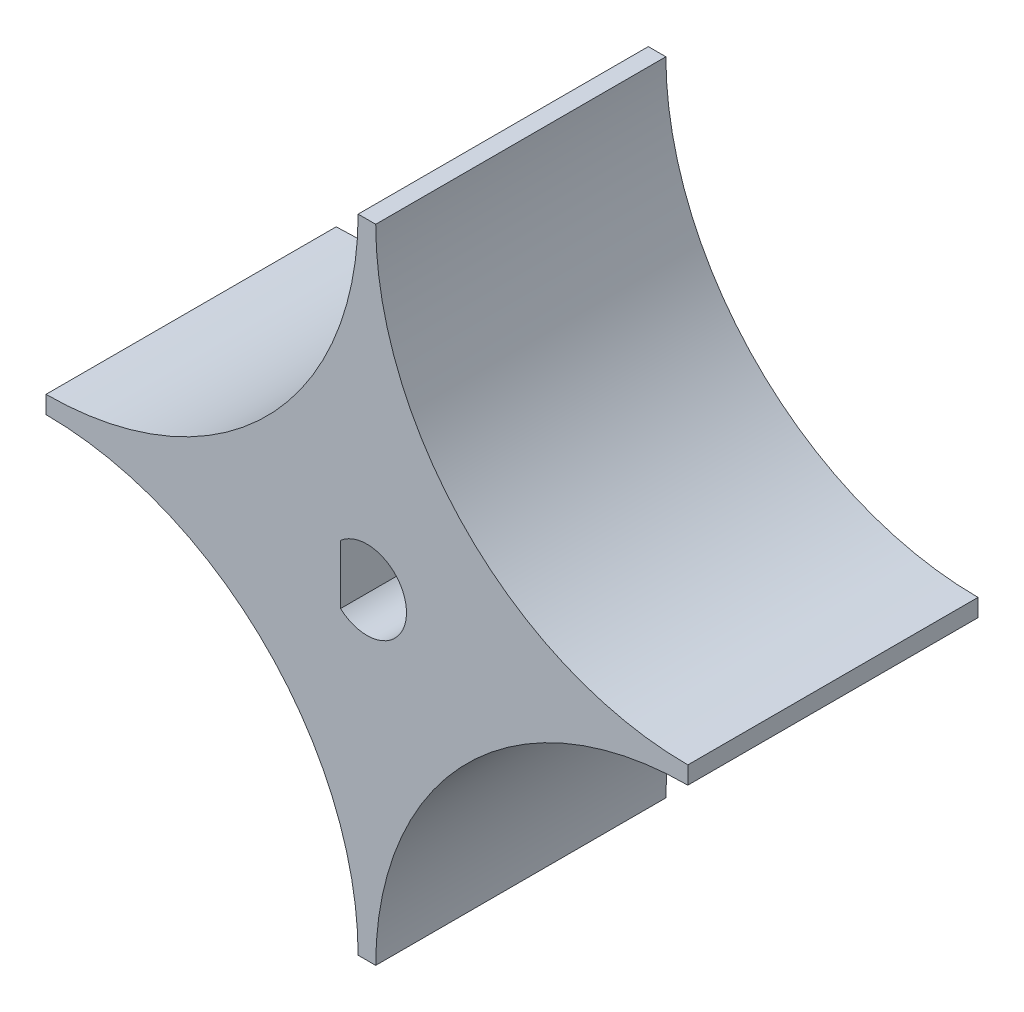
ISO-10303-21;
HEADER;
FILE_DESCRIPTION(('STEP AP214'),'2;1');
FILE_NAME('part.step','',(''),(''),'','','');
FILE_SCHEMA(('AUTOMOTIVE_DESIGN { 1 0 10303 214 1 1 1 1 }'));
ENDSEC;
DATA;
#1=APPLICATION_CONTEXT('core data for automotive mechanical design processes');
#2=APPLICATION_PROTOCOL_DEFINITION('international standard','automotive_design',2000,#1);
#3=PRODUCT_CONTEXT('',#1,'mechanical');
#4=PRODUCT('Part','Part','',(#3));
#5=PRODUCT_RELATED_PRODUCT_CATEGORY('part','',(#4));
#6=PRODUCT_DEFINITION_FORMATION('','',#4);
#7=PRODUCT_DEFINITION_CONTEXT('part definition',#1,'design');
#8=PRODUCT_DEFINITION('design','',#6,#7);
#9=PRODUCT_DEFINITION_SHAPE('','',#8);
#10=(LENGTH_UNIT() NAMED_UNIT(*) SI_UNIT(.MILLI.,.METRE.));
#11=(NAMED_UNIT(*) PLANE_ANGLE_UNIT() SI_UNIT($,.RADIAN.));
#12=(NAMED_UNIT(*) SI_UNIT($,.STERADIAN.) SOLID_ANGLE_UNIT());
#13=UNCERTAINTY_MEASURE_WITH_UNIT(LENGTH_MEASURE(1.E-05),#10,'distance_accuracy_value','');
#14=(GEOMETRIC_REPRESENTATION_CONTEXT(3) GLOBAL_UNCERTAINTY_ASSIGNED_CONTEXT((#13)) GLOBAL_UNIT_ASSIGNED_CONTEXT((#10,
#11,#12)) REPRESENTATION_CONTEXT('',''));
#15=CARTESIAN_POINT('',(0.,0.,0.));
#16=DIRECTION('',(0.,0.,1.));
#17=DIRECTION('',(1.,0.,0.));
#18=AXIS2_PLACEMENT_3D('',#15,#16,#17);
#19=CARTESIAN_POINT('',(-23.8867105036406,20.7769926773726,33.));
#20=DIRECTION('',(0.,0.,-1.));
#21=DIRECTION('',(-1.,0.,0.));
#22=AXIS2_PLACEMENT_3D('',#19,#20,#21);
#23=CYLINDRICAL_SURFACE('',#22,35.5);
#24=CARTESIAN_POINT('',(-23.8867105036406,20.7769926773726,0.));
#25=DIRECTION('',(0.,0.,-1.));
#26=DIRECTION('',(1.,0.,0.));
#27=AXIS2_PLACEMENT_3D('',#24,#25,#26);
#28=CIRCLE('',#27,35.5);
#29=CARTESIAN_POINT('',(11.6132894963594,20.7769926773726,0.));
#30=VERTEX_POINT('',#29);
#31=CARTESIAN_POINT('',(-23.8867105036406,-14.7230073226274,0.));
#32=VERTEX_POINT('',#31);
#33=EDGE_CURVE('E154',#30,#32,#28,.T.);
#34=ORIENTED_EDGE('',*,*,#33,.T.);
#35=DIRECTION('',(0.,0.,-1.));
#36=VECTOR('',#35,1.);
#37=CARTESIAN_POINT('',(-23.8867105036406,-14.7230073226274,33.));
#38=LINE('',#37,#36);
#39=CARTESIAN_POINT('',(-23.8867105036406,-14.7230073226274,33.));
#40=VERTEX_POINT('',#39);
#41=EDGE_CURVE('E11',#40,#32,#38,.T.);
#42=ORIENTED_EDGE('',*,*,#41,.F.);
#43=CARTESIAN_POINT('',(-23.8867105036406,20.7769926773726,33.));
#44=DIRECTION('',(0.,0.,-1.));
#45=DIRECTION('',(1.,0.,0.));
#46=AXIS2_PLACEMENT_3D('',#43,#44,#45);
#47=CIRCLE('',#46,35.5);
#48=CARTESIAN_POINT('',(11.6132894963594,20.7769926773726,33.));
#49=VERTEX_POINT('',#48);
#50=EDGE_CURVE('E156',#49,#40,#47,.T.);
#51=ORIENTED_EDGE('',*,*,#50,.F.);
#52=DIRECTION('',(0.,0.,-1.));
#53=VECTOR('',#52,1.);
#54=CARTESIAN_POINT('',(11.6132894963594,20.7769926773726,33.));
#55=LINE('',#54,#53);
#56=EDGE_CURVE('E174',#49,#30,#55,.T.);
#57=ORIENTED_EDGE('',*,*,#56,.T.);
#58=EDGE_LOOP('',(#34,#42,#51,#57));
#59=FACE_BOUND('',#58,.T.);
#60=ADVANCED_FACE('F33',(#59),#23,.F.);
#61=CARTESIAN_POINT('',(-23.8867105036406,-14.7230073226274,33.));
#62=DIRECTION('',(1.,0.,0.));
#63=DIRECTION('',(0.,0.,-1.));
#64=AXIS2_PLACEMENT_3D('',#61,#62,#63);
#65=PLANE('',#64);
#66=DIRECTION('',(0.,-1.,0.));
#67=VECTOR('',#66,1.);
#68=CARTESIAN_POINT('',(-23.8867105036406,-14.7230073226274,0.));
#69=LINE('',#68,#67);
#70=CARTESIAN_POINT('',(-23.8867105036406,-16.7230073226274,0.));
#71=VERTEX_POINT('',#70);
#72=EDGE_CURVE('E177',#32,#71,#69,.T.);
#73=ORIENTED_EDGE('',*,*,#72,.T.);
#74=DIRECTION('',(0.,0.,-1.));
#75=VECTOR('',#74,1.);
#76=CARTESIAN_POINT('',(-23.8867105036406,-16.7230073226274,33.));
#77=LINE('',#76,#75);
#78=CARTESIAN_POINT('',(-23.8867105036406,-16.7230073226274,33.));
#79=VERTEX_POINT('',#78);
#80=EDGE_CURVE('E40',#79,#71,#77,.T.);
#81=ORIENTED_EDGE('',*,*,#80,.F.);
#82=DIRECTION('',(0.,-1.,0.));
#83=VECTOR('',#82,1.);
#84=CARTESIAN_POINT('',(-23.8867105036406,-14.7230073226274,33.));
#85=LINE('',#84,#83);
#86=EDGE_CURVE('E159',#40,#79,#85,.T.);
#87=ORIENTED_EDGE('',*,*,#86,.F.);
#88=ORIENTED_EDGE('',*,*,#41,.T.);
#89=EDGE_LOOP('',(#73,#81,#87,#88));
#90=FACE_BOUND('',#89,.T.);
#91=ADVANCED_FACE('F234',(#90),#65,.F.);
#92=CARTESIAN_POINT('',(-23.8867105036406,-52.2230073226274,33.));
#93=DIRECTION('',(0.,0.,-1.));
#94=DIRECTION('',(-1.,0.,0.));
#95=AXIS2_PLACEMENT_3D('',#92,#93,#94);
#96=CYLINDRICAL_SURFACE('',#95,35.5);
#97=CARTESIAN_POINT('',(-23.8867105036406,-52.2230073226274,0.));
#98=DIRECTION('',(0.,0.,-1.));
#99=DIRECTION('',(1.,0.,0.));
#100=AXIS2_PLACEMENT_3D('',#97,#98,#99);
#101=CIRCLE('',#100,35.5);
#102=CARTESIAN_POINT('',(11.6132894963594,-52.2230073226274,0.));
#103=VERTEX_POINT('',#102);
#104=EDGE_CURVE('E179',#71,#103,#101,.T.);
#105=ORIENTED_EDGE('',*,*,#104,.T.);
#106=DIRECTION('',(0.,0.,-1.));
#107=VECTOR('',#106,1.);
#108=CARTESIAN_POINT('',(11.6132894963594,-52.2230073226274,33.));
#109=LINE('',#108,#107);
#110=CARTESIAN_POINT('',(11.6132894963594,-52.2230073226274,33.));
#111=VERTEX_POINT('',#110);
#112=EDGE_CURVE('E204',#111,#103,#109,.T.);
#113=ORIENTED_EDGE('',*,*,#112,.F.);
#114=CARTESIAN_POINT('',(-23.8867105036406,-52.2230073226274,33.));
#115=DIRECTION('',(0.,0.,-1.));
#116=DIRECTION('',(1.,0.,0.));
#117=AXIS2_PLACEMENT_3D('',#114,#115,#116);
#118=CIRCLE('',#117,35.5);
#119=EDGE_CURVE('E162',#79,#111,#118,.T.);
#120=ORIENTED_EDGE('',*,*,#119,.F.);
#121=ORIENTED_EDGE('',*,*,#80,.T.);
#122=EDGE_LOOP('',(#105,#113,#120,#121));
#123=FACE_BOUND('',#122,.T.);
#124=ADVANCED_FACE('F211',(#123),#96,.F.);
#125=CARTESIAN_POINT('',(11.6132894963594,-52.2230073226274,33.));
#126=DIRECTION('',(0.,1.,0.));
#127=DIRECTION('',(0.,0.,1.));
#128=AXIS2_PLACEMENT_3D('',#125,#126,#127);
#129=PLANE('',#128);
#130=DIRECTION('',(1.,0.,0.));
#131=VECTOR('',#130,1.);
#132=CARTESIAN_POINT('',(11.6132894963594,-52.2230073226274,0.));
#133=LINE('',#132,#131);
#134=CARTESIAN_POINT('',(13.6132894963594,-52.2230073226274,0.));
#135=VERTEX_POINT('',#134);
#136=EDGE_CURVE('E181',#103,#135,#133,.T.);
#137=ORIENTED_EDGE('',*,*,#136,.T.);
#138=DIRECTION('',(0.,0.,-1.));
#139=VECTOR('',#138,1.);
#140=CARTESIAN_POINT('',(13.6132894963594,-52.2230073226274,33.));
#141=LINE('',#140,#139);
#142=CARTESIAN_POINT('',(13.6132894963594,-52.2230073226274,33.));
#143=VERTEX_POINT('',#142);
#144=EDGE_CURVE('E201',#143,#135,#141,.T.);
#145=ORIENTED_EDGE('',*,*,#144,.F.);
#146=DIRECTION('',(1.,0.,0.));
#147=VECTOR('',#146,1.);
#148=CARTESIAN_POINT('',(11.6132894963594,-52.2230073226274,33.));
#149=LINE('',#148,#147);
#150=EDGE_CURVE('E164',#111,#143,#149,.T.);
#151=ORIENTED_EDGE('',*,*,#150,.F.);
#152=ORIENTED_EDGE('',*,*,#112,.T.);
#153=EDGE_LOOP('',(#137,#145,#151,#152));
#154=FACE_BOUND('',#153,.T.);
#155=ADVANCED_FACE('F222',(#154),#129,.F.);
#156=CARTESIAN_POINT('',(49.1132894963594,-52.2230073226274,33.));
#157=DIRECTION('',(0.,0.,-1.));
#158=DIRECTION('',(-1.,0.,0.));
#159=AXIS2_PLACEMENT_3D('',#156,#157,#158);
#160=CYLINDRICAL_SURFACE('',#159,35.5);
#161=CARTESIAN_POINT('',(49.1132894963594,-52.2230073226274,0.));
#162=DIRECTION('',(0.,0.,-1.));
#163=DIRECTION('',(1.,0.,0.));
#164=AXIS2_PLACEMENT_3D('',#161,#162,#163);
#165=CIRCLE('',#164,35.5);
#166=CARTESIAN_POINT('',(49.1132894963594,-16.7230073226274,0.));
#167=VERTEX_POINT('',#166);
#168=EDGE_CURVE('E183',#135,#167,#165,.T.);
#169=ORIENTED_EDGE('',*,*,#168,.T.);
#170=DIRECTION('',(0.,0.,-1.));
#171=VECTOR('',#170,1.);
#172=CARTESIAN_POINT('',(49.1132894963594,-16.7230073226274,33.));
#173=LINE('',#172,#171);
#174=CARTESIAN_POINT('',(49.1132894963594,-16.7230073226274,33.));
#175=VERTEX_POINT('',#174);
#176=EDGE_CURVE('E198',#175,#167,#173,.T.);
#177=ORIENTED_EDGE('',*,*,#176,.F.);
#178=CARTESIAN_POINT('',(49.1132894963594,-52.2230073226274,33.));
#179=DIRECTION('',(0.,0.,-1.));
#180=DIRECTION('',(1.,0.,0.));
#181=AXIS2_PLACEMENT_3D('',#178,#179,#180);
#182=CIRCLE('',#181,35.5);
#183=EDGE_CURVE('E166',#143,#175,#182,.T.);
#184=ORIENTED_EDGE('',*,*,#183,.F.);
#185=ORIENTED_EDGE('',*,*,#144,.T.);
#186=EDGE_LOOP('',(#169,#177,#184,#185));
#187=FACE_BOUND('',#186,.T.);
#188=ADVANCED_FACE('F226',(#187),#160,.F.);
#189=CARTESIAN_POINT('',(49.1132894963594,-14.7230073226274,33.));
#190=DIRECTION('',(-1.,0.,0.));
#191=DIRECTION('',(0.,0.,1.));
#192=AXIS2_PLACEMENT_3D('',#189,#190,#191);
#193=PLANE('',#192);
#194=DIRECTION('',(0.,1.,0.));
#195=VECTOR('',#194,1.);
#196=CARTESIAN_POINT('',(49.1132894963594,-14.7230073226274,0.));
#197=LINE('',#196,#195);
#198=CARTESIAN_POINT('',(49.1132894963594,-14.7230073226274,0.));
#199=VERTEX_POINT('',#198);
#200=EDGE_CURVE('E185',#167,#199,#197,.T.);
#201=ORIENTED_EDGE('',*,*,#200,.T.);
#202=DIRECTION('',(0.,0.,-1.));
#203=VECTOR('',#202,1.);
#204=CARTESIAN_POINT('',(49.1132894963594,-14.7230073226274,33.));
#205=LINE('',#204,#203);
#206=CARTESIAN_POINT('',(49.1132894963594,-14.7230073226274,33.));
#207=VERTEX_POINT('',#206);
#208=EDGE_CURVE('E195',#207,#199,#205,.T.);
#209=ORIENTED_EDGE('',*,*,#208,.F.);
#210=DIRECTION('',(0.,1.,0.));
#211=VECTOR('',#210,1.);
#212=CARTESIAN_POINT('',(49.1132894963594,-14.7230073226274,33.));
#213=LINE('',#212,#211);
#214=EDGE_CURVE('E168',#175,#207,#213,.T.);
#215=ORIENTED_EDGE('',*,*,#214,.F.);
#216=ORIENTED_EDGE('',*,*,#176,.T.);
#217=EDGE_LOOP('',(#201,#209,#215,#216));
#218=FACE_BOUND('',#217,.T.);
#219=ADVANCED_FACE('F247',(#218),#193,.F.);
#220=CARTESIAN_POINT('',(49.1132894963594,20.7769926773726,33.));
#221=DIRECTION('',(0.,0.,-1.));
#222=DIRECTION('',(-1.,0.,0.));
#223=AXIS2_PLACEMENT_3D('',#220,#221,#222);
#224=CYLINDRICAL_SURFACE('',#223,35.5);
#225=CARTESIAN_POINT('',(49.1132894963594,20.7769926773726,0.));
#226=DIRECTION('',(0.,0.,-1.));
#227=DIRECTION('',(1.,0.,0.));
#228=AXIS2_PLACEMENT_3D('',#225,#226,#227);
#229=CIRCLE('',#228,35.5);
#230=CARTESIAN_POINT('',(13.6132894963594,20.7769926773726,0.));
#231=VERTEX_POINT('',#230);
#232=EDGE_CURVE('E187',#199,#231,#229,.T.);
#233=ORIENTED_EDGE('',*,*,#232,.T.);
#234=DIRECTION('',(0.,0.,-1.));
#235=VECTOR('',#234,1.);
#236=CARTESIAN_POINT('',(13.6132894963594,20.7769926773726,33.));
#237=LINE('',#236,#235);
#238=CARTESIAN_POINT('',(13.6132894963594,20.7769926773726,33.));
#239=VERTEX_POINT('',#238);
#240=EDGE_CURVE('E192',#239,#231,#237,.T.);
#241=ORIENTED_EDGE('',*,*,#240,.F.);
#242=CARTESIAN_POINT('',(49.1132894963594,20.7769926773726,33.));
#243=DIRECTION('',(0.,0.,-1.));
#244=DIRECTION('',(1.,0.,0.));
#245=AXIS2_PLACEMENT_3D('',#242,#243,#244);
#246=CIRCLE('',#245,35.5);
#247=EDGE_CURVE('E170',#207,#239,#246,.T.);
#248=ORIENTED_EDGE('',*,*,#247,.F.);
#249=ORIENTED_EDGE('',*,*,#208,.T.);
#250=EDGE_LOOP('',(#233,#241,#248,#249));
#251=FACE_BOUND('',#250,.T.);
#252=ADVANCED_FACE('F245',(#251),#224,.F.);
#253=CARTESIAN_POINT('',(11.6132894963594,20.7769926773726,33.));
#254=DIRECTION('',(0.,-1.,0.));
#255=DIRECTION('',(1.,0.,0.));
#256=AXIS2_PLACEMENT_3D('',#253,#254,#255);
#257=PLANE('',#256);
#258=DIRECTION('',(-1.,0.,0.));
#259=VECTOR('',#258,1.);
#260=CARTESIAN_POINT('',(11.6132894963594,20.7769926773726,0.));
#261=LINE('',#260,#259);
#262=EDGE_CURVE('E160',#231,#30,#261,.T.);
#263=ORIENTED_EDGE('',*,*,#262,.T.);
#264=ORIENTED_EDGE('',*,*,#56,.F.);
#265=DIRECTION('',(-1.,0.,0.));
#266=VECTOR('',#265,1.);
#267=CARTESIAN_POINT('',(11.6132894963594,20.7769926773726,33.));
#268=LINE('',#267,#266);
#269=EDGE_CURVE('E172',#239,#49,#268,.T.);
#270=ORIENTED_EDGE('',*,*,#269,.F.);
#271=ORIENTED_EDGE('',*,*,#240,.T.);
#272=EDGE_LOOP('',(#263,#264,#270,#271));
#273=FACE_BOUND('',#272,.T.);
#274=ADVANCED_FACE('F240',(#273),#257,.F.);
#275=CARTESIAN_POINT('',(-23.8867105036406,20.7769926773726,33.));
#276=DIRECTION('',(0.,0.,1.));
#277=DIRECTION('',(1.,0.,0.));
#278=AXIS2_PLACEMENT_3D('',#275,#276,#277);
#279=PLANE('',#278);
#280=CARTESIAN_POINT('',(12.6132894963594,-15.7230073226274,33.));
#281=DIRECTION('',(0.,0.,1.));
#282=DIRECTION('',(1.,0.,0.));
#283=AXIS2_PLACEMENT_3D('',#280,#281,#282);
#284=CIRCLE('',#283,4.5);
#285=CARTESIAN_POINT('',(9.61328949635939,-19.0771092888771,33.));
#286=VERTEX_POINT('',#285);
#287=CARTESIAN_POINT('',(9.61328949635939,-12.3689053563777,33.));
#288=VERTEX_POINT('',#287);
#289=EDGE_CURVE('E55',#286,#288,#284,.T.);
#290=ORIENTED_EDGE('',*,*,#289,.F.);
#291=DIRECTION('',(0.,-1.,0.));
#292=VECTOR('',#291,1.);
#293=CARTESIAN_POINT('',(9.61328949635939,-12.3689053563777,33.));
#294=LINE('',#293,#292);
#295=EDGE_CURVE('E145',#288,#286,#294,.T.);
#296=ORIENTED_EDGE('',*,*,#295,.F.);
#297=EDGE_LOOP('',(#290,#296));
#298=FACE_BOUND('',#297,.T.);
#299=ORIENTED_EDGE('',*,*,#50,.T.);
#300=ORIENTED_EDGE('',*,*,#86,.T.);
#301=ORIENTED_EDGE('',*,*,#119,.T.);
#302=ORIENTED_EDGE('',*,*,#150,.T.);
#303=ORIENTED_EDGE('',*,*,#183,.T.);
#304=ORIENTED_EDGE('',*,*,#214,.T.);
#305=ORIENTED_EDGE('',*,*,#247,.T.);
#306=ORIENTED_EDGE('',*,*,#269,.T.);
#307=EDGE_LOOP('',(#299,#300,#301,#302,#303,#304,#305,#306));
#308=FACE_BOUND('',#307,.T.);
#309=ADVANCED_FACE('F230',(#298,#308),#279,.T.);
#310=CARTESIAN_POINT('',(-23.8867105036406,20.7769926773726,0.));
#311=DIRECTION('',(0.,0.,1.));
#312=DIRECTION('',(1.,0.,0.));
#313=AXIS2_PLACEMENT_3D('',#310,#311,#312);
#314=PLANE('',#313);
#315=DIRECTION('',(0.,-1.,0.));
#316=VECTOR('',#315,1.);
#317=CARTESIAN_POINT('',(15.6132894963594,-12.3689053563777,0.));
#318=LINE('',#317,#316);
#319=CARTESIAN_POINT('',(15.6132894963594,-12.3689053563777,0.));
#320=VERTEX_POINT('',#319);
#321=CARTESIAN_POINT('',(15.6132894963594,-19.0771092888771,0.));
#322=VERTEX_POINT('',#321);
#323=EDGE_CURVE('E133',#320,#322,#318,.T.);
#324=ORIENTED_EDGE('',*,*,#323,.F.);
#325=CARTESIAN_POINT('',(12.6132894963594,-15.7230073226274,0.));
#326=DIRECTION('',(0.,0.,-1.));
#327=DIRECTION('',(-1.,0.,0.));
#328=AXIS2_PLACEMENT_3D('',#325,#326,#327);
#329=CIRCLE('',#328,4.50000000000001);
#330=EDGE_CURVE('E47',#322,#320,#329,.T.);
#331=ORIENTED_EDGE('',*,*,#330,.F.);
#332=EDGE_LOOP('',(#324,#331));
#333=FACE_BOUND('',#332,.T.);
#334=ORIENTED_EDGE('',*,*,#33,.F.);
#335=ORIENTED_EDGE('',*,*,#262,.F.);
#336=ORIENTED_EDGE('',*,*,#232,.F.);
#337=ORIENTED_EDGE('',*,*,#200,.F.);
#338=ORIENTED_EDGE('',*,*,#168,.F.);
#339=ORIENTED_EDGE('',*,*,#136,.F.);
#340=ORIENTED_EDGE('',*,*,#104,.F.);
#341=ORIENTED_EDGE('',*,*,#72,.F.);
#342=EDGE_LOOP('',(#334,#335,#336,#337,#338,#339,#340,#341));
#343=FACE_BOUND('',#342,.T.);
#344=ADVANCED_FACE('F217',(#333,#343),#314,.F.);
#345=CARTESIAN_POINT('',(12.6132894963594,-15.7230073226274,23.));
#346=DIRECTION('',(0.,0.,1.));
#347=DIRECTION('',(1.,0.,0.));
#348=AXIS2_PLACEMENT_3D('',#345,#346,#347);
#349=CYLINDRICAL_SURFACE('',#348,4.5);
#350=ORIENTED_EDGE('',*,*,#289,.T.);
#351=DIRECTION('',(0.,0.,1.));
#352=VECTOR('',#351,1.);
#353=CARTESIAN_POINT('',(9.61328949635939,-12.3689053563777,23.));
#354=LINE('',#353,#352);
#355=CARTESIAN_POINT('',(9.61328949635939,-12.3689053563777,23.));
#356=VERTEX_POINT('',#355);
#357=EDGE_CURVE('E148',#356,#288,#354,.T.);
#358=ORIENTED_EDGE('',*,*,#357,.F.);
#359=CARTESIAN_POINT('',(12.6132894963594,-15.7230073226274,23.));
#360=DIRECTION('',(0.,0.,1.));
#361=DIRECTION('',(1.,0.,0.));
#362=AXIS2_PLACEMENT_3D('',#359,#360,#361);
#363=CIRCLE('',#362,4.5);
#364=CARTESIAN_POINT('',(9.61328949635939,-19.0771092888771,23.));
#365=VERTEX_POINT('',#364);
#366=EDGE_CURVE('E141',#365,#356,#363,.T.);
#367=ORIENTED_EDGE('',*,*,#366,.F.);
#368=DIRECTION('',(0.,0.,1.));
#369=VECTOR('',#368,1.);
#370=CARTESIAN_POINT('',(9.61328949635939,-19.0771092888771,23.));
#371=LINE('',#370,#369);
#372=EDGE_CURVE('E152',#365,#286,#371,.T.);
#373=ORIENTED_EDGE('',*,*,#372,.T.);
#374=EDGE_LOOP('',(#350,#358,#367,#373));
#375=FACE_BOUND('',#374,.T.);
#376=ADVANCED_FACE('F308',(#375),#349,.F.);
#377=CARTESIAN_POINT('',(9.61328949635939,-12.3689053563777,23.));
#378=DIRECTION('',(-1.,0.,0.));
#379=DIRECTION('',(0.,0.,1.));
#380=AXIS2_PLACEMENT_3D('',#377,#378,#379);
#381=PLANE('',#380);
#382=ORIENTED_EDGE('',*,*,#295,.T.);
#383=ORIENTED_EDGE('',*,*,#372,.F.);
#384=DIRECTION('',(0.,-1.,0.));
#385=VECTOR('',#384,1.);
#386=CARTESIAN_POINT('',(9.61328949635939,-12.3689053563777,23.));
#387=LINE('',#386,#385);
#388=EDGE_CURVE('E144',#356,#365,#387,.T.);
#389=ORIENTED_EDGE('',*,*,#388,.F.);
#390=ORIENTED_EDGE('',*,*,#357,.T.);
#391=EDGE_LOOP('',(#382,#383,#389,#390));
#392=FACE_BOUND('',#391,.T.);
#393=ADVANCED_FACE('F313',(#392),#381,.F.);
#394=CARTESIAN_POINT('',(12.6132894963594,-15.7230073226274,23.));
#395=DIRECTION('',(0.,0.,1.));
#396=DIRECTION('',(1.,0.,0.));
#397=AXIS2_PLACEMENT_3D('',#394,#395,#396);
#398=PLANE('',#397);
#399=ORIENTED_EDGE('',*,*,#366,.T.);
#400=ORIENTED_EDGE('',*,*,#388,.T.);
#401=EDGE_LOOP('',(#399,#400));
#402=FACE_BOUND('',#401,.T.);
#403=ADVANCED_FACE('F322',(#402),#398,.T.);
#404=CARTESIAN_POINT('',(12.6132894963594,-15.7230073226274,10.));
#405=DIRECTION('',(0.,0.,-1.));
#406=DIRECTION('',(-1.,0.,0.));
#407=AXIS2_PLACEMENT_3D('',#404,#405,#406);
#408=CYLINDRICAL_SURFACE('',#407,4.50000000000001);
#409=ORIENTED_EDGE('',*,*,#330,.T.);
#410=DIRECTION('',(0.,0.,-1.));
#411=VECTOR('',#410,1.);
#412=CARTESIAN_POINT('',(15.6132894963594,-12.3689053563777,10.));
#413=LINE('',#412,#411);
#414=CARTESIAN_POINT('',(15.6132894963594,-12.3689053563777,10.));
#415=VERTEX_POINT('',#414);
#416=EDGE_CURVE('E119',#415,#320,#413,.T.);
#417=ORIENTED_EDGE('',*,*,#416,.F.);
#418=CARTESIAN_POINT('',(12.6132894963594,-15.7230073226274,10.));
#419=DIRECTION('',(0.,0.,-1.));
#420=DIRECTION('',(-1.,0.,0.));
#421=AXIS2_PLACEMENT_3D('',#418,#419,#420);
#422=CIRCLE('',#421,4.50000000000001);
#423=CARTESIAN_POINT('',(15.6132894963594,-19.0771092888771,10.));
#424=VERTEX_POINT('',#423);
#425=EDGE_CURVE('E122',#424,#415,#422,.T.);
#426=ORIENTED_EDGE('',*,*,#425,.F.);
#427=DIRECTION('',(0.,0.,-1.));
#428=VECTOR('',#427,1.);
#429=CARTESIAN_POINT('',(15.6132894963594,-19.0771092888771,10.));
#430=LINE('',#429,#428);
#431=EDGE_CURVE('E128',#424,#322,#430,.T.);
#432=ORIENTED_EDGE('',*,*,#431,.T.);
#433=EDGE_LOOP('',(#409,#417,#426,#432));
#434=FACE_BOUND('',#433,.T.);
#435=ADVANCED_FACE('F121',(#434),#408,.F.);
#436=CARTESIAN_POINT('',(15.6132894963594,-12.3689053563777,10.));
#437=DIRECTION('',(1.,0.,0.));
#438=DIRECTION('',(0.,0.,-1.));
#439=AXIS2_PLACEMENT_3D('',#436,#437,#438);
#440=PLANE('',#439);
#441=ORIENTED_EDGE('',*,*,#323,.T.);
#442=ORIENTED_EDGE('',*,*,#431,.F.);
#443=DIRECTION('',(0.,-1.,0.));
#444=VECTOR('',#443,1.);
#445=CARTESIAN_POINT('',(15.6132894963594,-12.3689053563777,10.));
#446=LINE('',#445,#444);
#447=EDGE_CURVE('E129',#415,#424,#446,.T.);
#448=ORIENTED_EDGE('',*,*,#447,.F.);
#449=ORIENTED_EDGE('',*,*,#416,.T.);
#450=EDGE_LOOP('',(#441,#442,#448,#449));
#451=FACE_BOUND('',#450,.T.);
#452=ADVANCED_FACE('F135',(#451),#440,.F.);
#453=CARTESIAN_POINT('',(12.6132894963594,-15.7230073226274,10.));
#454=DIRECTION('',(0.,0.,-1.));
#455=DIRECTION('',(-1.,0.,0.));
#456=AXIS2_PLACEMENT_3D('',#453,#454,#455);
#457=PLANE('',#456);
#458=ORIENTED_EDGE('',*,*,#425,.T.);
#459=ORIENTED_EDGE('',*,*,#447,.T.);
#460=EDGE_LOOP('',(#458,#459));
#461=FACE_BOUND('',#460,.T.);
#462=ADVANCED_FACE('F132',(#461),#457,.T.);
#463=CLOSED_SHELL('',(#60,#91,#124,#155,#188,#219,#252,#274,#309,#344,#376,#393,#403,#435,#452,#462));
#464=MANIFOLD_SOLID_BREP('B2',#463);
#465=ADVANCED_BREP_SHAPE_REPRESENTATION('',(#18,#464),#14);
#466=SHAPE_DEFINITION_REPRESENTATION(#9,#465);
ENDSEC;
END-ISO-10303-21;
